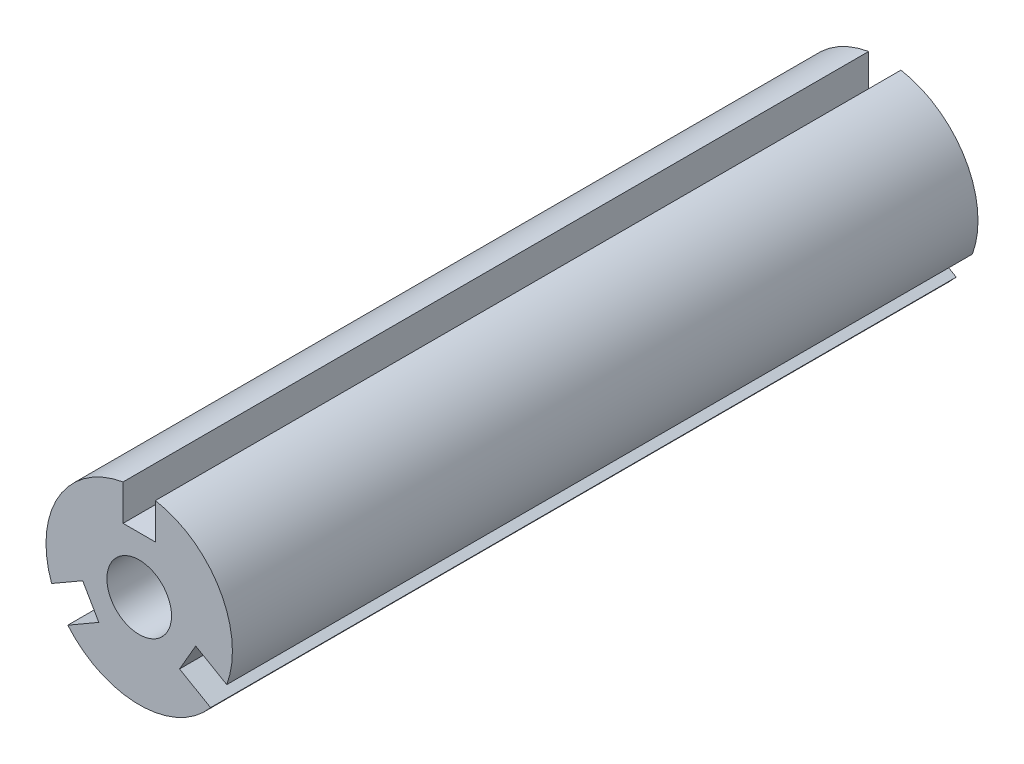
ISO-10303-21;
HEADER;
FILE_DESCRIPTION(('STEP AP214'),'2;1');
FILE_NAME('part.step','',(''),(''),'','','');
FILE_SCHEMA(('AUTOMOTIVE_DESIGN { 1 0 10303 214 1 1 1 1 }'));
ENDSEC;
DATA;
#1=APPLICATION_CONTEXT('core data for automotive mechanical design processes');
#2=APPLICATION_PROTOCOL_DEFINITION('international standard','automotive_design',2000,#1);
#3=PRODUCT_CONTEXT('',#1,'mechanical');
#4=PRODUCT('Part','Part','',(#3));
#5=PRODUCT_RELATED_PRODUCT_CATEGORY('part','',(#4));
#6=PRODUCT_DEFINITION_FORMATION('','',#4);
#7=PRODUCT_DEFINITION_CONTEXT('part definition',#1,'design');
#8=PRODUCT_DEFINITION('design','',#6,#7);
#9=PRODUCT_DEFINITION_SHAPE('','',#8);
#10=(LENGTH_UNIT() NAMED_UNIT(*) SI_UNIT(.MILLI.,.METRE.));
#11=(NAMED_UNIT(*) PLANE_ANGLE_UNIT() SI_UNIT($,.RADIAN.));
#12=(NAMED_UNIT(*) SI_UNIT($,.STERADIAN.) SOLID_ANGLE_UNIT());
#13=UNCERTAINTY_MEASURE_WITH_UNIT(LENGTH_MEASURE(1.E-05),#10,'distance_accuracy_value','');
#14=(GEOMETRIC_REPRESENTATION_CONTEXT(3) GLOBAL_UNCERTAINTY_ASSIGNED_CONTEXT((#13)) GLOBAL_UNIT_ASSIGNED_CONTEXT((#10,
#11,#12)) REPRESENTATION_CONTEXT('',''));
#15=CARTESIAN_POINT('',(0.,0.,0.));
#16=DIRECTION('',(0.,0.,1.));
#17=DIRECTION('',(1.,0.,0.));
#18=AXIS2_PLACEMENT_3D('',#15,#16,#17);
#19=CARTESIAN_POINT('',(0.,0.,60.));
#20=DIRECTION('',(0.,0.,-1.));
#21=DIRECTION('',(-1.,0.,0.));
#22=AXIS2_PLACEMENT_3D('',#19,#20,#21);
#23=CYLINDRICAL_SURFACE('',#22,7.5);
#24=CARTESIAN_POINT('',(0.,0.,0.));
#25=DIRECTION('',(0.,0.,1.));
#26=DIRECTION('',(1.,0.,0.));
#27=AXIS2_PLACEMENT_3D('',#24,#25,#26);
#28=CIRCLE('',#27,7.5);
#29=CARTESIAN_POINT('',(-1.30000000000044,7.38647412504768,0.));
#30=VERTEX_POINT('',#29);
#31=CARTESIAN_POINT('',(-7.04687423668763,-2.56740403760453,0.));
#32=VERTEX_POINT('',#31);
#33=EDGE_CURVE('E164',#30,#32,#28,.T.);
#34=ORIENTED_EDGE('',*,*,#33,.T.);
#35=DIRECTION('',(0.,0.,-1.));
#36=VECTOR('',#35,1.);
#37=CARTESIAN_POINT('',(-7.04687423668763,-2.56740403760453,60.));
#38=LINE('',#37,#36);
#39=CARTESIAN_POINT('',(-7.04687423668763,-2.56740403760453,60.));
#40=VERTEX_POINT('',#39);
#41=EDGE_CURVE('E11',#40,#32,#38,.T.);
#42=ORIENTED_EDGE('',*,*,#41,.F.);
#43=CARTESIAN_POINT('',(0.,0.,60.));
#44=DIRECTION('',(0.,0.,1.));
#45=DIRECTION('',(1.,0.,0.));
#46=AXIS2_PLACEMENT_3D('',#43,#44,#45);
#47=CIRCLE('',#46,7.5);
#48=CARTESIAN_POINT('',(-1.30000000000044,7.38647412504768,60.));
#49=VERTEX_POINT('',#48);
#50=EDGE_CURVE('E187',#49,#40,#47,.T.);
#51=ORIENTED_EDGE('',*,*,#50,.F.);
#52=DIRECTION('',(0.,0.,-1.));
#53=VECTOR('',#52,1.);
#54=CARTESIAN_POINT('',(-1.30000000000044,7.38647412504768,60.));
#55=LINE('',#54,#53);
#56=EDGE_CURVE('E160',#49,#30,#55,.T.);
#57=ORIENTED_EDGE('',*,*,#56,.T.);
#58=EDGE_LOOP('',(#34,#42,#51,#57));
#59=FACE_BOUND('',#58,.T.);
#60=ADVANCED_FACE('F38',(#59),#23,.T.);
#61=CARTESIAN_POINT('',(-7.04687423668763,-2.56740403760453,60.));
#62=DIRECTION('',(-0.499999999999999,0.866025403784439,0.));
#63=DIRECTION('',(-0.866025403784439,-0.499999999999999,0.));
#64=AXIS2_PLACEMENT_3D('',#61,#62,#63);
#65=PLANE('',#64);
#66=DIRECTION('',(0.866025403784439,0.499999999999999,0.));
#67=VECTOR('',#66,1.);
#68=CARTESIAN_POINT('',(-7.04687423668763,-2.56740403760453,0.));
#69=LINE('',#68,#67);
#70=CARTESIAN_POINT('',(-4.54711431702975,-1.12416697508062,0.));
#71=VERTEX_POINT('',#70);
#72=EDGE_CURVE('E167',#32,#71,#69,.T.);
#73=ORIENTED_EDGE('',*,*,#72,.T.);
#74=DIRECTION('',(0.,0.,-1.));
#75=VECTOR('',#74,1.);
#76=CARTESIAN_POINT('',(-4.54711431702975,-1.12416697508062,60.));
#77=LINE('',#76,#75);
#78=CARTESIAN_POINT('',(-4.54711431702975,-1.12416697508062,60.));
#79=VERTEX_POINT('',#78);
#80=EDGE_CURVE('E52',#79,#71,#77,.T.);
#81=ORIENTED_EDGE('',*,*,#80,.F.);
#82=DIRECTION('',(0.866025403784439,0.499999999999999,0.));
#83=VECTOR('',#82,1.);
#84=CARTESIAN_POINT('',(-7.04687423668763,-2.56740403760453,60.));
#85=LINE('',#84,#83);
#86=EDGE_CURVE('E115',#40,#79,#85,.T.);
#87=ORIENTED_EDGE('',*,*,#86,.F.);
#88=ORIENTED_EDGE('',*,*,#41,.T.);
#89=EDGE_LOOP('',(#73,#81,#87,#88));
#90=FACE_BOUND('',#89,.T.);
#91=ADVANCED_FACE('F267',(#90),#65,.F.);
#92=CARTESIAN_POINT('',(-3.24711431702975,-3.37583302492016,60.));
#93=DIRECTION('',(0.866025403784438,0.5,0.));
#94=DIRECTION('',(-0.500000000000001,0.866025403784438,0.));
#95=AXIS2_PLACEMENT_3D('',#92,#93,#94);
#96=PLANE('',#95);
#97=DIRECTION('',(0.500000000000001,-0.866025403784438,0.));
#98=VECTOR('',#97,1.);
#99=CARTESIAN_POINT('',(-3.24711431702975,-3.37583302492016,0.));
#100=LINE('',#99,#98);
#101=CARTESIAN_POINT('',(-3.24711431702975,-3.37583302492016,0.));
#102=VERTEX_POINT('',#101);
#103=EDGE_CURVE('E170',#71,#102,#100,.T.);
#104=ORIENTED_EDGE('',*,*,#103,.T.);
#105=DIRECTION('',(0.,0.,-1.));
#106=VECTOR('',#105,1.);
#107=CARTESIAN_POINT('',(-3.24711431702975,-3.37583302492016,60.));
#108=LINE('',#107,#106);
#109=CARTESIAN_POINT('',(-3.24711431702975,-3.37583302492016,60.));
#110=VERTEX_POINT('',#109);
#111=EDGE_CURVE('E206',#110,#102,#108,.T.);
#112=ORIENTED_EDGE('',*,*,#111,.F.);
#113=DIRECTION('',(0.500000000000001,-0.866025403784438,0.));
#114=VECTOR('',#113,1.);
#115=CARTESIAN_POINT('',(-3.24711431702975,-3.37583302492016,60.));
#116=LINE('',#115,#114);
#117=EDGE_CURVE('E215',#79,#110,#116,.T.);
#118=ORIENTED_EDGE('',*,*,#117,.F.);
#119=ORIENTED_EDGE('',*,*,#80,.T.);
#120=EDGE_LOOP('',(#104,#112,#118,#119));
#121=FACE_BOUND('',#120,.T.);
#122=ADVANCED_FACE('F213',(#121),#96,.F.);
#123=CARTESIAN_POINT('',(-5.7468742366875,-4.81907008744399,60.));
#124=DIRECTION('',(0.499999999999999,-0.866025403784439,0.));
#125=DIRECTION('',(0.866025403784439,0.499999999999999,0.));
#126=AXIS2_PLACEMENT_3D('',#123,#124,#125);
#127=PLANE('',#126);
#128=DIRECTION('',(-0.866025403784439,-0.499999999999999,0.));
#129=VECTOR('',#128,1.);
#130=CARTESIAN_POINT('',(-5.7468742366875,-4.81907008744399,0.));
#131=LINE('',#130,#129);
#132=CARTESIAN_POINT('',(-5.7468742366875,-4.81907008744399,0.));
#133=VERTEX_POINT('',#132);
#134=EDGE_CURVE('E172',#102,#133,#131,.T.);
#135=ORIENTED_EDGE('',*,*,#134,.T.);
#136=DIRECTION('',(0.,0.,-1.));
#137=VECTOR('',#136,1.);
#138=CARTESIAN_POINT('',(-5.7468742366875,-4.81907008744399,60.));
#139=LINE('',#138,#137);
#140=CARTESIAN_POINT('',(-5.7468742366875,-4.81907008744399,60.));
#141=VERTEX_POINT('',#140);
#142=EDGE_CURVE('E203',#141,#133,#139,.T.);
#143=ORIENTED_EDGE('',*,*,#142,.F.);
#144=DIRECTION('',(-0.866025403784439,-0.499999999999999,0.));
#145=VECTOR('',#144,1.);
#146=CARTESIAN_POINT('',(-5.7468742366875,-4.81907008744399,60.));
#147=LINE('',#146,#145);
#148=EDGE_CURVE('E233',#110,#141,#147,.T.);
#149=ORIENTED_EDGE('',*,*,#148,.F.);
#150=ORIENTED_EDGE('',*,*,#111,.T.);
#151=EDGE_LOOP('',(#135,#143,#149,#150));
#152=FACE_BOUND('',#151,.T.);
#153=ADVANCED_FACE('F224',(#152),#127,.F.);
#154=CARTESIAN_POINT('',(0.,0.,60.));
#155=DIRECTION('',(0.,0.,-1.));
#156=DIRECTION('',(-1.,0.,0.));
#157=AXIS2_PLACEMENT_3D('',#154,#155,#156);
#158=CYLINDRICAL_SURFACE('',#157,7.5);
#159=CARTESIAN_POINT('',(0.,-7.5,32.4));
#160=CARTESIAN_POINT('',(0.13124370947397,-7.4999996781544,32.3999996345241));
#161=CARTESIAN_POINT('',(0.262491955588592,-7.49652276234533,32.3891991070811));
#162=CARTESIAN_POINT('',(0.521140351856224,-7.4829939325834,32.3464022707061));
#163=CARTESIAN_POINT('',(0.648539795060562,-7.47294081830337,32.3144020922731));
#164=CARTESIAN_POINT('',(0.895723838687348,-7.44735575453114,32.2304026181823));
#165=CARTESIAN_POINT('',(1.01552021007689,-7.43183253067787,32.1784351614441));
#166=CARTESIAN_POINT('',(1.24469814427674,-7.39690352464308,32.0561147548691));
#167=CARTESIAN_POINT('',(1.35407791053742,-7.37749707450578,31.9857586413516));
#168=CARTESIAN_POINT('',(1.56284213669247,-7.33615601900737,31.826273829744));
#169=CARTESIAN_POINT('',(1.6618441383696,-7.31416436599377,31.7366593515699));
#170=CARTESIAN_POINT('',(1.84370135539842,-7.27045598554605,31.5422354001789));
#171=CARTESIAN_POINT('',(1.92655337690696,-7.24873931328492,31.4374229285177));
#172=CARTESIAN_POINT('',(2.07587092610747,-7.20742216198544,31.2122207182344));
#173=CARTESIAN_POINT('',(2.14185184664916,-7.18789178453125,31.0914955780942));
#174=CARTESIAN_POINT('',(2.25241375701885,-7.15401986697968,30.8399364843448));
#175=CARTESIAN_POINT('',(2.2970006965999,-7.13967688452024,30.7091053530175));
#176=CARTESIAN_POINT('',(2.36209701466982,-7.11840184140896,30.4453760890907));
#177=CARTESIAN_POINT('',(2.38331845269578,-7.11125122399116,30.3126718473719));
#178=CARTESIAN_POINT('',(2.40330649588276,-7.104522465675,30.0454086012233));
#179=CARTESIAN_POINT('',(2.4020794064058,-7.10494219840959,29.910850128222));
#180=CARTESIAN_POINT('',(2.37776071104571,-7.11311428650112,29.6496516226676));
#181=CARTESIAN_POINT('',(2.35558263199087,-7.1205602614563,29.5229153198329));
#182=CARTESIAN_POINT('',(2.29147588461208,-7.14144686169243,29.2750667333669));
#183=CARTESIAN_POINT('',(2.24954502403991,-7.15488815235037,29.1539550756222));
#184=CARTESIAN_POINT('',(2.14649467738218,-7.1864798124546,28.9186532117614));
#185=CARTESIAN_POINT('',(2.08509409655584,-7.20469844204043,28.8045956700728));
#186=CARTESIAN_POINT('',(1.94504241501101,-7.24376167291752,28.5881069354599));
#187=CARTESIAN_POINT('',(1.86638665240732,-7.2646069832181,28.4856788958847));
#188=CARTESIAN_POINT('',(1.6896082731058,-7.30779558212807,28.2902029907006));
#189=CARTESIAN_POINT('',(1.59073404374104,-7.3301628121227,28.1978388345918));
#190=CARTESIAN_POINT('',(1.37862214832573,-7.37299752172316,28.0308319826495));
#191=CARTESIAN_POINT('',(1.26538331347904,-7.3934648465056,27.9561907302857));
#192=CARTESIAN_POINT('',(1.02639237106856,-7.43042684616876,27.8262548350797));
#193=CARTESIAN_POINT('',(0.900541919160954,-7.44688620821913,27.7711303487453));
#194=CARTESIAN_POINT('',(0.640703775541696,-7.47372241650294,27.6830406050059));
#195=CARTESIAN_POINT('',(0.506718694697322,-7.48410120306955,27.6500682782749));
#196=CARTESIAN_POINT('',(0.240212684383977,-7.49729136358702,27.6083999000022));
#197=CARTESIAN_POINT('',(0.10785042902561,-7.50039090267231,27.5987788895834));
#198=CARTESIAN_POINT('',(-0.156615404382159,-7.49952982977666,27.601468827332));
#199=CARTESIAN_POINT('',(-0.28871901913116,-7.49557030506309,27.6137763979648));
#200=CARTESIAN_POINT('',(-0.545302527305719,-7.48122570476245,27.6592351696217));
#201=CARTESIAN_POINT('',(-0.669891543717035,-7.47101229973898,27.6918298651289));
#202=CARTESIAN_POINT('',(-0.911792481900874,-7.44536378993023,27.7762526990944));
#203=CARTESIAN_POINT('',(-1.02910349069119,-7.4299280315932,27.8280832449033));
#204=CARTESIAN_POINT('',(-1.25639538580567,-7.39493296529857,27.9509565257672));
#205=CARTESIAN_POINT('',(-1.36611843075145,-7.37527989405135,28.0224487679135));
#206=CARTESIAN_POINT('',(-1.57231725450993,-7.3340911236072,28.1820808094784));
#207=CARTESIAN_POINT('',(-1.66878926333098,-7.31255489148117,28.2702253296875));
#208=CARTESIAN_POINT('',(-1.84992482232953,-7.26889450924855,28.4650112394164));
#209=CARTESIAN_POINT('',(-1.9339286921343,-7.24678326250102,28.5722704015327));
#210=CARTESIAN_POINT('',(-2.08281212988854,-7.20540664665217,28.7998420116873));
#211=CARTESIAN_POINT('',(-2.14769185538462,-7.18614125410707,28.9201543521811));
#212=CARTESIAN_POINT('',(-2.25611370451847,-7.15284394329862,29.1702653679841));
#213=CARTESIAN_POINT('',(-2.29972599461169,-7.13879485230076,29.3000312024845));
#214=CARTESIAN_POINT('',(-2.36431002369302,-7.11766922548992,29.5656108147155));
#215=CARTESIAN_POINT('',(-2.3852909250985,-7.110589868051,29.701422121704));
#216=CARTESIAN_POINT('',(-2.40333802967349,-7.10450891848152,29.968313953746));
#217=CARTESIAN_POINT('',(-2.40149082669009,-7.10514028637073,30.0993135169935));
#218=CARTESIAN_POINT('',(-2.37657532724055,-7.11351238640617,30.3590355081521));
#219=CARTESIAN_POINT('',(-2.35350811291681,-7.12125275601947,30.4877580518416));
#220=CARTESIAN_POINT('',(-2.28754998624692,-7.14270814716624,30.7372251380653));
#221=CARTESIAN_POINT('',(-2.24498441914059,-7.15632490855144,30.8580647983393));
#222=CARTESIAN_POINT('',(-2.14149641226573,-7.18796963391543,31.0909826406012));
#223=CARTESIAN_POINT('',(-2.08057011171938,-7.20599852549879,31.2030589736441));
#224=CARTESIAN_POINT('',(-1.93918900061148,-7.24535241552564,31.4202144447216));
#225=CARTESIAN_POINT('',(-1.85803962647367,-7.2667817857902,31.5248223941011));
#226=CARTESIAN_POINT('',(-1.67972099689326,-7.3100577127103,31.7192876187314));
#227=CARTESIAN_POINT('',(-1.58254737250234,-7.33190438170043,31.809140857798));
#228=CARTESIAN_POINT('',(-1.37086831544753,-7.37446662300175,31.9746874288858));
#229=CARTESIAN_POINT('',(-1.25587702764117,-7.39511627820578,32.0497784278265));
#230=CARTESIAN_POINT('',(-1.01424529489041,-7.4321068154679,32.1794702821458));
#231=CARTESIAN_POINT('',(-0.887608894812236,-7.4484491860694,32.2340782189812));
#232=CARTESIAN_POINT('',(-0.635495147467268,-7.47402511596098,32.3178716697457));
#233=CARTESIAN_POINT('',(-0.510565149730997,-7.48367851952176,32.3485776758747));
#234=CARTESIAN_POINT('',(-0.257091001614181,-7.49666540312091,32.389639714356));
#235=CARTESIAN_POINT('',(-0.128547676892093,-7.50000031523419,32.4000003579682));
#236=CARTESIAN_POINT('',(0.,-7.5,32.4));
#237=B_SPLINE_CURVE_WITH_KNOTS('',3,(#159,#160,#161,#162,#163,#164,#165,#166,#167,#168,#169,
#170,#171,#172,#173,#174,#175,#176,#177,#178,#179,#180,#181,#182,#183,#184,#185,#186,#187,#188,
#189,#190,#191,#192,#193,#194,#195,#196,#197,#198,#199,#200,#201,#202,#203,#204,#205,#206,#207,
#208,#209,#210,#211,#212,#213,#214,#215,#216,#217,#218,#219,#220,#221,#222,#223,#224,#225,#226,
#227,#228,#229,#230,#231,#232,#233,#234,#235,#236),.UNSPECIFIED.,.T.,.F.,(4,2,2,2,2,2,2,2,2,2,2,
2,2,2,2,2,2,2,2,2,2,2,2,2,2,2,2,2,2,2,2,2,2,2,2,2,2,2,4),(0.,0.393258434799731,
0.786588669522547,1.17929430316757,1.57206754447054,1.9762457722735,2.38050385002639,
2.7953224323994,3.21002558507932,3.6117073499926,4.01327629191335,4.39810634027168,
4.78297910878167,5.17368293902145,5.56449245719513,5.97400927212934,6.38355942936832,
6.79659707001292,7.20950283699523,7.60576515887017,8.00196645199048,8.38775124581683,
8.773584336575,9.16910032582622,9.56472860947227,9.97684489579589,10.3889577869691,
10.7997016601266,11.2102791793319,11.6013920245927,11.9924849256448,12.3772773432197,
12.7621507290106,13.1627063501388,13.5633713622838,13.9779942829689,14.3924737267459,
14.7777411045802,15.1629211517942),.UNSPECIFIED.);
#238=CARTESIAN_POINT('',(0.,-7.5,32.4));
#239=VERTEX_POINT('',#238);
#240=EDGE_CURVE('E285',#239,#239,#237,.T.);
#241=ORIENTED_EDGE('',*,*,#240,.T.);
#242=EDGE_LOOP('',(#241));
#243=FACE_BOUND('',#242,.T.);
#244=CARTESIAN_POINT('',(0.,0.,0.));
#245=DIRECTION('',(0.,0.,1.));
#246=DIRECTION('',(1.,0.,0.));
#247=AXIS2_PLACEMENT_3D('',#244,#245,#246);
#248=CIRCLE('',#247,7.5);
#249=CARTESIAN_POINT('',(5.74687423668808,-4.8190700874433,0.));
#250=VERTEX_POINT('',#249);
#251=EDGE_CURVE('E174',#133,#250,#248,.T.);
#252=ORIENTED_EDGE('',*,*,#251,.T.);
#253=DIRECTION('',(0.,0.,-1.));
#254=VECTOR('',#253,1.);
#255=CARTESIAN_POINT('',(5.74687423668808,-4.8190700874433,60.));
#256=LINE('',#255,#254);
#257=CARTESIAN_POINT('',(5.74687423668808,-4.8190700874433,60.));
#258=VERTEX_POINT('',#257);
#259=EDGE_CURVE('E200',#258,#250,#256,.T.);
#260=ORIENTED_EDGE('',*,*,#259,.F.);
#261=CARTESIAN_POINT('',(0.,0.,60.));
#262=DIRECTION('',(0.,0.,1.));
#263=DIRECTION('',(1.,0.,0.));
#264=AXIS2_PLACEMENT_3D('',#261,#262,#263);
#265=CIRCLE('',#264,7.5);
#266=EDGE_CURVE('E230',#141,#258,#265,.T.);
#267=ORIENTED_EDGE('',*,*,#266,.F.);
#268=ORIENTED_EDGE('',*,*,#142,.T.);
#269=EDGE_LOOP('',(#252,#260,#267,#268));
#270=FACE_BOUND('',#269,.T.);
#271=ADVANCED_FACE('F228',(#243,#270),#158,.T.);
#272=CARTESIAN_POINT('',(5.74687423668808,-4.8190700874433,60.));
#273=DIRECTION('',(-0.500000000000002,-0.866025403784438,0.));
#274=DIRECTION('',(0.866025403784438,-0.500000000000002,0.));
#275=AXIS2_PLACEMENT_3D('',#272,#273,#274);
#276=PLANE('',#275);
#277=DIRECTION('',(-0.866025403784438,0.500000000000002,0.));
#278=VECTOR('',#277,1.);
#279=CARTESIAN_POINT('',(5.74687423668808,-4.8190700874433,0.));
#280=LINE('',#279,#278);
#281=CARTESIAN_POINT('',(3.2471143170302,-3.37583302491938,0.));
#282=VERTEX_POINT('',#281);
#283=EDGE_CURVE('E176',#250,#282,#280,.T.);
#284=ORIENTED_EDGE('',*,*,#283,.T.);
#285=DIRECTION('',(0.,0.,-1.));
#286=VECTOR('',#285,1.);
#287=CARTESIAN_POINT('',(3.2471143170302,-3.37583302491938,60.));
#288=LINE('',#287,#286);
#289=CARTESIAN_POINT('',(3.2471143170302,-3.37583302491938,60.));
#290=VERTEX_POINT('',#289);
#291=EDGE_CURVE('E197',#290,#282,#288,.T.);
#292=ORIENTED_EDGE('',*,*,#291,.F.);
#293=DIRECTION('',(-0.866025403784438,0.500000000000002,0.));
#294=VECTOR('',#293,1.);
#295=CARTESIAN_POINT('',(5.74687423668808,-4.8190700874433,60.));
#296=LINE('',#295,#294);
#297=EDGE_CURVE('E232',#258,#290,#296,.T.);
#298=ORIENTED_EDGE('',*,*,#297,.F.);
#299=ORIENTED_EDGE('',*,*,#259,.T.);
#300=EDGE_LOOP('',(#284,#292,#298,#299));
#301=FACE_BOUND('',#300,.T.);
#302=ADVANCED_FACE('F281',(#301),#276,.F.);
#303=CARTESIAN_POINT('',(4.5471143170302,-1.12416697507984,60.));
#304=DIRECTION('',(-0.866025403784439,0.5,0.));
#305=DIRECTION('',(-0.5,-0.866025403784439,0.));
#306=AXIS2_PLACEMENT_3D('',#303,#304,#305);
#307=PLANE('',#306);
#308=DIRECTION('',(0.5,0.866025403784439,0.));
#309=VECTOR('',#308,1.);
#310=CARTESIAN_POINT('',(4.5471143170302,-1.12416697507984,0.));
#311=LINE('',#310,#309);
#312=CARTESIAN_POINT('',(4.5471143170302,-1.12416697507984,0.));
#313=VERTEX_POINT('',#312);
#314=EDGE_CURVE('E178',#282,#313,#311,.T.);
#315=ORIENTED_EDGE('',*,*,#314,.T.);
#316=DIRECTION('',(0.,0.,-1.));
#317=VECTOR('',#316,1.);
#318=CARTESIAN_POINT('',(4.5471143170302,-1.12416697507984,60.));
#319=LINE('',#318,#317);
#320=CARTESIAN_POINT('',(4.5471143170302,-1.12416697507984,60.));
#321=VERTEX_POINT('',#320);
#322=EDGE_CURVE('E194',#321,#313,#319,.T.);
#323=ORIENTED_EDGE('',*,*,#322,.F.);
#324=DIRECTION('',(0.5,0.866025403784439,0.));
#325=VECTOR('',#324,1.);
#326=CARTESIAN_POINT('',(4.5471143170302,-1.12416697507984,60.));
#327=LINE('',#326,#325);
#328=EDGE_CURVE('E235',#290,#321,#327,.T.);
#329=ORIENTED_EDGE('',*,*,#328,.F.);
#330=ORIENTED_EDGE('',*,*,#291,.T.);
#331=EDGE_LOOP('',(#315,#323,#329,#330));
#332=FACE_BOUND('',#331,.T.);
#333=ADVANCED_FACE('F366',(#332),#307,.F.);
#334=CARTESIAN_POINT('',(7.04687423668794,-2.56740403760368,60.));
#335=DIRECTION('',(0.500000000000001,0.866025403784438,0.));
#336=DIRECTION('',(-0.866025403784438,0.500000000000001,0.));
#337=AXIS2_PLACEMENT_3D('',#334,#335,#336);
#338=PLANE('',#337);
#339=DIRECTION('',(0.866025403784438,-0.500000000000001,0.));
#340=VECTOR('',#339,1.);
#341=CARTESIAN_POINT('',(7.04687423668794,-2.56740403760368,0.));
#342=LINE('',#341,#340);
#343=CARTESIAN_POINT('',(7.04687423668794,-2.56740403760368,0.));
#344=VERTEX_POINT('',#343);
#345=EDGE_CURVE('E180',#313,#344,#342,.T.);
#346=ORIENTED_EDGE('',*,*,#345,.T.);
#347=DIRECTION('',(0.,0.,-1.));
#348=VECTOR('',#347,1.);
#349=CARTESIAN_POINT('',(7.04687423668794,-2.56740403760368,60.));
#350=LINE('',#349,#348);
#351=CARTESIAN_POINT('',(7.04687423668794,-2.56740403760368,60.));
#352=VERTEX_POINT('',#351);
#353=EDGE_CURVE('E191',#352,#344,#350,.T.);
#354=ORIENTED_EDGE('',*,*,#353,.F.);
#355=DIRECTION('',(0.866025403784438,-0.500000000000001,0.));
#356=VECTOR('',#355,1.);
#357=CARTESIAN_POINT('',(7.04687423668794,-2.56740403760368,60.));
#358=LINE('',#357,#356);
#359=EDGE_CURVE('E241',#321,#352,#358,.T.);
#360=ORIENTED_EDGE('',*,*,#359,.F.);
#361=ORIENTED_EDGE('',*,*,#322,.T.);
#362=EDGE_LOOP('',(#346,#354,#360,#361));
#363=FACE_BOUND('',#362,.T.);
#364=ADVANCED_FACE('F247',(#363),#338,.F.);
#365=CARTESIAN_POINT('',(0.,0.,60.));
#366=DIRECTION('',(0.,0.,-1.));
#367=DIRECTION('',(-1.,0.,0.));
#368=AXIS2_PLACEMENT_3D('',#365,#366,#367);
#369=CYLINDRICAL_SURFACE('',#368,7.5);
#370=CARTESIAN_POINT('',(0.,0.,0.));
#371=DIRECTION('',(0.,0.,1.));
#372=DIRECTION('',(1.,0.,0.));
#373=AXIS2_PLACEMENT_3D('',#370,#371,#372);
#374=CIRCLE('',#373,7.5);
#375=CARTESIAN_POINT('',(1.29999999999956,7.38647412504783,0.));
#376=VERTEX_POINT('',#375);
#377=EDGE_CURVE('E182',#344,#376,#374,.T.);
#378=ORIENTED_EDGE('',*,*,#377,.T.);
#379=DIRECTION('',(0.,0.,-1.));
#380=VECTOR('',#379,1.);
#381=CARTESIAN_POINT('',(1.29999999999956,7.38647412504783,60.));
#382=LINE('',#381,#380);
#383=CARTESIAN_POINT('',(1.29999999999956,7.38647412504783,60.));
#384=VERTEX_POINT('',#383);
#385=EDGE_CURVE('E155',#384,#376,#382,.T.);
#386=ORIENTED_EDGE('',*,*,#385,.F.);
#387=CARTESIAN_POINT('',(0.,0.,60.));
#388=DIRECTION('',(0.,0.,1.));
#389=DIRECTION('',(1.,0.,0.));
#390=AXIS2_PLACEMENT_3D('',#387,#388,#389);
#391=CIRCLE('',#390,7.5);
#392=EDGE_CURVE('E146',#352,#384,#391,.T.);
#393=ORIENTED_EDGE('',*,*,#392,.F.);
#394=ORIENTED_EDGE('',*,*,#353,.T.);
#395=EDGE_LOOP('',(#378,#386,#393,#394));
#396=FACE_BOUND('',#395,.T.);
#397=ADVANCED_FACE('F251',(#396),#369,.T.);
#398=CARTESIAN_POINT('',(1.29999999999956,7.38647412504783,60.));
#399=DIRECTION('',(1.,0.,0.));
#400=DIRECTION('',(0.,1.,0.));
#401=AXIS2_PLACEMENT_3D('',#398,#399,#400);
#402=PLANE('',#401);
#403=DIRECTION('',(0.,-1.,0.));
#404=VECTOR('',#403,1.);
#405=CARTESIAN_POINT('',(1.29999999999956,7.38647412504783,0.));
#406=LINE('',#405,#404);
#407=CARTESIAN_POINT('',(1.29999999999955,4.5,0.));
#408=VERTEX_POINT('',#407);
#409=EDGE_CURVE('E154',#376,#408,#406,.T.);
#410=ORIENTED_EDGE('',*,*,#409,.T.);
#411=DIRECTION('',(0.,0.,-1.));
#412=VECTOR('',#411,1.);
#413=CARTESIAN_POINT('',(1.29999999999955,4.5,60.));
#414=LINE('',#413,#412);
#415=CARTESIAN_POINT('',(1.29999999999955,4.5,60.));
#416=VERTEX_POINT('',#415);
#417=EDGE_CURVE('E151',#416,#408,#414,.T.);
#418=ORIENTED_EDGE('',*,*,#417,.F.);
#419=DIRECTION('',(0.,-1.,0.));
#420=VECTOR('',#419,1.);
#421=CARTESIAN_POINT('',(1.29999999999956,7.38647412504783,60.));
#422=LINE('',#421,#420);
#423=EDGE_CURVE('E140',#384,#416,#422,.T.);
#424=ORIENTED_EDGE('',*,*,#423,.F.);
#425=ORIENTED_EDGE('',*,*,#385,.T.);
#426=EDGE_LOOP('',(#410,#418,#424,#425));
#427=FACE_BOUND('',#426,.T.);
#428=ADVANCED_FACE('F152',(#427),#402,.F.);
#429=CARTESIAN_POINT('',(-1.30000000000045,4.5,60.));
#430=DIRECTION('',(0.,-1.,0.));
#431=DIRECTION('',(0.,0.,-1.));
#432=AXIS2_PLACEMENT_3D('',#429,#430,#431);
#433=PLANE('',#432);
#434=DIRECTION('',(-1.,0.,0.));
#435=VECTOR('',#434,1.);
#436=CARTESIAN_POINT('',(-1.30000000000045,4.5,0.));
#437=LINE('',#436,#435);
#438=CARTESIAN_POINT('',(-1.30000000000045,4.5,0.));
#439=VERTEX_POINT('',#438);
#440=EDGE_CURVE('E101',#408,#439,#437,.T.);
#441=ORIENTED_EDGE('',*,*,#440,.T.);
#442=DIRECTION('',(0.,0.,-1.));
#443=VECTOR('',#442,1.);
#444=CARTESIAN_POINT('',(-1.30000000000045,4.5,60.));
#445=LINE('',#444,#443);
#446=CARTESIAN_POINT('',(-1.30000000000045,4.5,60.));
#447=VERTEX_POINT('',#446);
#448=EDGE_CURVE('E156',#447,#439,#445,.T.);
#449=ORIENTED_EDGE('',*,*,#448,.F.);
#450=DIRECTION('',(-1.,0.,0.));
#451=VECTOR('',#450,1.);
#452=CARTESIAN_POINT('',(-1.30000000000045,4.5,60.));
#453=LINE('',#452,#451);
#454=EDGE_CURVE('E144',#416,#447,#453,.T.);
#455=ORIENTED_EDGE('',*,*,#454,.F.);
#456=ORIENTED_EDGE('',*,*,#417,.T.);
#457=EDGE_LOOP('',(#441,#449,#455,#456));
#458=FACE_BOUND('',#457,.T.);
#459=ADVANCED_FACE('F158',(#458),#433,.F.);
#460=CARTESIAN_POINT('',(-1.30000000000044,7.38647412504768,60.));
#461=DIRECTION('',(-1.,0.,0.));
#462=DIRECTION('',(0.,-1.,0.));
#463=AXIS2_PLACEMENT_3D('',#460,#461,#462);
#464=PLANE('',#463);
#465=DIRECTION('',(0.,1.,0.));
#466=VECTOR('',#465,1.);
#467=CARTESIAN_POINT('',(-1.30000000000044,7.38647412504768,0.));
#468=LINE('',#467,#466);
#469=EDGE_CURVE('E107',#439,#30,#468,.T.);
#470=ORIENTED_EDGE('',*,*,#469,.T.);
#471=ORIENTED_EDGE('',*,*,#56,.F.);
#472=DIRECTION('',(0.,1.,0.));
#473=VECTOR('',#472,1.);
#474=CARTESIAN_POINT('',(-1.30000000000044,7.38647412504768,60.));
#475=LINE('',#474,#473);
#476=EDGE_CURVE('E60',#447,#49,#475,.T.);
#477=ORIENTED_EDGE('',*,*,#476,.F.);
#478=ORIENTED_EDGE('',*,*,#448,.T.);
#479=EDGE_LOOP('',(#470,#471,#477,#478));
#480=FACE_BOUND('',#479,.T.);
#481=ADVANCED_FACE('F255',(#480),#464,.F.);
#482=CARTESIAN_POINT('',(0.,0.,60.));
#483=DIRECTION('',(0.,0.,1.));
#484=DIRECTION('',(1.,0.,0.));
#485=AXIS2_PLACEMENT_3D('',#482,#483,#484);
#486=PLANE('',#485);
#487=CARTESIAN_POINT('',(0.,0.,60.));
#488=DIRECTION('',(0.,0.,1.));
#489=DIRECTION('',(1.,0.,0.));
#490=AXIS2_PLACEMENT_3D('',#487,#488,#489);
#491=CIRCLE('',#490,2.6);
#492=CARTESIAN_POINT('',(2.6,0.,60.));
#493=VERTEX_POINT('',#492);
#494=EDGE_CURVE('E291',#493,#493,#491,.T.);
#495=ORIENTED_EDGE('',*,*,#494,.F.);
#496=EDGE_LOOP('',(#495));
#497=FACE_BOUND('',#496,.T.);
#498=ORIENTED_EDGE('',*,*,#50,.T.);
#499=ORIENTED_EDGE('',*,*,#86,.T.);
#500=ORIENTED_EDGE('',*,*,#117,.T.);
#501=ORIENTED_EDGE('',*,*,#148,.T.);
#502=ORIENTED_EDGE('',*,*,#266,.T.);
#503=ORIENTED_EDGE('',*,*,#297,.T.);
#504=ORIENTED_EDGE('',*,*,#328,.T.);
#505=ORIENTED_EDGE('',*,*,#359,.T.);
#506=ORIENTED_EDGE('',*,*,#392,.T.);
#507=ORIENTED_EDGE('',*,*,#423,.T.);
#508=ORIENTED_EDGE('',*,*,#454,.T.);
#509=ORIENTED_EDGE('',*,*,#476,.T.);
#510=EDGE_LOOP('',(#498,#499,#500,#501,#502,#503,#504,#505,#506,#507,#508,#509));
#511=FACE_BOUND('',#510,.T.);
#512=ADVANCED_FACE('F142',(#497,#511),#486,.T.);
#513=CARTESIAN_POINT('',(0.,0.,0.));
#514=DIRECTION('',(0.,0.,1.));
#515=DIRECTION('',(1.,0.,0.));
#516=AXIS2_PLACEMENT_3D('',#513,#514,#515);
#517=PLANE('',#516);
#518=CARTESIAN_POINT('',(0.,0.,0.));
#519=DIRECTION('',(0.,0.,1.));
#520=DIRECTION('',(1.,0.,0.));
#521=AXIS2_PLACEMENT_3D('',#518,#519,#520);
#522=CIRCLE('',#521,2.6);
#523=CARTESIAN_POINT('',(2.6,0.,0.));
#524=VERTEX_POINT('',#523);
#525=EDGE_CURVE('E168',#524,#524,#522,.T.);
#526=ORIENTED_EDGE('',*,*,#525,.T.);
#527=EDGE_LOOP('',(#526));
#528=FACE_BOUND('',#527,.T.);
#529=ORIENTED_EDGE('',*,*,#33,.F.);
#530=ORIENTED_EDGE('',*,*,#469,.F.);
#531=ORIENTED_EDGE('',*,*,#440,.F.);
#532=ORIENTED_EDGE('',*,*,#409,.F.);
#533=ORIENTED_EDGE('',*,*,#377,.F.);
#534=ORIENTED_EDGE('',*,*,#345,.F.);
#535=ORIENTED_EDGE('',*,*,#314,.F.);
#536=ORIENTED_EDGE('',*,*,#283,.F.);
#537=ORIENTED_EDGE('',*,*,#251,.F.);
#538=ORIENTED_EDGE('',*,*,#134,.F.);
#539=ORIENTED_EDGE('',*,*,#103,.F.);
#540=ORIENTED_EDGE('',*,*,#72,.F.);
#541=EDGE_LOOP('',(#529,#530,#531,#532,#533,#534,#535,#536,#537,#538,#539,#540));
#542=FACE_BOUND('',#541,.T.);
#543=ADVANCED_FACE('F219',(#528,#542),#517,.F.);
#544=CARTESIAN_POINT('',(0.,0.,0.));
#545=DIRECTION('',(0.,0.,1.));
#546=DIRECTION('',(1.,0.,0.));
#547=AXIS2_PLACEMENT_3D('',#544,#545,#546);
#548=CYLINDRICAL_SURFACE('',#547,2.6);
#549=CARTESIAN_POINT('',(0.,-2.6,32.4));
#550=CARTESIAN_POINT('',(-0.110253293289517,-2.59999193091976,32.3999918557324));
#551=CARTESIAN_POINT('',(-0.220578358244194,-2.59292376288972,32.3923396404243));
#552=CARTESIAN_POINT('',(-0.437496805693455,-2.56526750690049,32.36233565564));
#553=CARTESIAN_POINT('',(-0.544085759557476,-2.54466390989173,32.3399670238822));
#554=CARTESIAN_POINT('',(-0.749796994989789,-2.49178998062186,32.2823557462199));
#555=CARTESIAN_POINT('',(-0.848963357748623,-2.4595964531508,32.2471978373515));
#556=CARTESIAN_POINT('',(-1.03881942943321,-2.38563585985758,32.165995582834));
#557=CARTESIAN_POINT('',(-1.12950597486161,-2.34386524108891,32.1199471967932));
#558=CARTESIAN_POINT('',(-1.33628329340981,-2.2344982810976,31.9984870166154));
#559=CARTESIAN_POINT('',(-1.44789529541142,-2.1632761864279,31.9187185518003));
#560=CARTESIAN_POINT('',(-1.65259463663395,-2.01128516755018,31.7455634384784));
#561=CARTESIAN_POINT('',(-1.74563749150799,-1.93049403964585,31.6521449949053));
#562=CARTESIAN_POINT('',(-1.91578353736409,-1.7619308261401,31.4517247963353));
#563=CARTESIAN_POINT('',(-1.99243414172537,-1.67403529419028,31.3444436060945));
#564=CARTESIAN_POINT('',(-2.09359001406653,-1.54270757935254,31.1752338022373));
#565=CARTESIAN_POINT('',(-2.12499174782237,-1.49904160814595,31.1174834178291));
#566=CARTESIAN_POINT('',(-2.18323658091873,-1.41285960541424,30.9989212370194));
#567=CARTESIAN_POINT('',(-2.21008196509532,-1.37034300656918,30.9381109949732));
#568=CARTESIAN_POINT('',(-2.25843926672024,-1.2890403557874,30.814692854847));
#569=CARTESIAN_POINT('',(-2.28007914215949,-1.25018329889017,30.7521825156896));
#570=CARTESIAN_POINT('',(-2.31869327576771,-1.17701513661225,30.6230600987196));
#571=CARTESIAN_POINT('',(-2.33566673139453,-1.14270481371476,30.5564473177675));
#572=CARTESIAN_POINT('',(-2.36199331033766,-1.08709725093047,30.4295141888591));
#573=CARTESIAN_POINT('',(-2.37213286185081,-1.06459469789769,30.369904087534));
#574=CARTESIAN_POINT('',(-2.38799151571338,-1.02854070687548,30.2475229275543));
#575=CARTESIAN_POINT('',(-2.39372618070245,-1.01495778040557,30.1847638397451));
#576=CARTESIAN_POINT('',(-2.39967397973977,-1.00080884778861,30.067044078534));
#577=CARTESIAN_POINT('',(-2.40058615721642,-0.998596287013189,30.0123252692065));
#578=CARTESIAN_POINT('',(-2.39867279663049,-1.00318129599667,29.903333176367));
#579=CARTESIAN_POINT('',(-2.39584554880426,-1.00998298731168,29.8490601080786));
#580=CARTESIAN_POINT('',(-2.38526167036109,-1.03477209113681,29.7251250122677));
#581=CARTESIAN_POINT('',(-2.37620361223052,-1.05567207158033,29.6561813696714));
#582=CARTESIAN_POINT('',(-2.35300223384909,-1.1064130282759,29.5224706980165));
#583=CARTESIAN_POINT('',(-2.33883559809614,-1.13629489194383,29.4577244508428));
#584=CARTESIAN_POINT('',(-2.30615209349664,-1.20124426916696,29.3322799384286));
#585=CARTESIAN_POINT('',(-2.28764231813448,-1.23630329281943,29.2715752775829));
#586=CARTESIAN_POINT('',(-2.24658906005949,-1.30942760754398,29.15338636981));
#587=CARTESIAN_POINT('',(-2.22404158193293,-1.34749585528981,29.0959053874609));
#588=CARTESIAN_POINT('',(-2.17504555153213,-1.42523427951783,28.9836695578659));
#589=CARTESIAN_POINT('',(-2.14859273942494,-1.46490617045622,28.928917775909));
#590=CARTESIAN_POINT('',(-2.09183122908231,-1.54487863517503,28.8219035804708));
#591=CARTESIAN_POINT('',(-2.06152110778426,-1.58517943613797,28.7696420955555));
#592=CARTESIAN_POINT('',(-1.99271328297662,-1.67108075547432,28.6606792914496));
#593=CARTESIAN_POINT('',(-1.95366273708306,-1.71667083412422,28.6043161507154));
#594=CARTESIAN_POINT('',(-1.87049363339437,-1.80693925540125,28.4946791859523));
#595=CARTESIAN_POINT('',(-1.82637321253713,-1.85161725571232,28.441406508489));
#596=CARTESIAN_POINT('',(-1.686381432995,-1.98303967030676,28.2866886831956));
#597=CARTESIAN_POINT('',(-1.58267932815999,-2.06743236944325,28.1900229077882));
#598=CARTESIAN_POINT('',(-1.3803876313033,-2.20588425623088,28.03355745439));
#599=CARTESIAN_POINT('',(-1.28611136869553,-2.26245510658531,27.9703927946573));
#600=CARTESIAN_POINT('',(-1.08527168664127,-2.36534593839431,27.8562940727371));
#601=CARTESIAN_POINT('',(-0.978722184030948,-2.41167735979778,27.8053463557652));
#602=CARTESIAN_POINT('',(-0.77270783978173,-2.48453014238679,27.7255533775342));
#603=CARTESIAN_POINT('',(-0.674813375292431,-2.51303059624426,27.6944811401753));
#604=CARTESIAN_POINT('',(-0.473332895418666,-2.55863187017592,27.6448579441416));
#605=CARTESIAN_POINT('',(-0.369750579910097,-2.57574000791219,27.6262989477015));
#606=CARTESIAN_POINT('',(-0.159283116503686,-2.59727878899119,27.6029439347014));
#607=CARTESIAN_POINT('',(-0.0523863121799221,-2.6016579172499,27.5982038438745));
#608=CARTESIAN_POINT('',(0.160804104888017,-2.59721172742758,27.6030207308395));
#609=CARTESIAN_POINT('',(0.267097718944866,-2.58838643809333,27.6125776775058));
#610=CARTESIAN_POINT('',(0.46895257402331,-2.55926097628564,27.6441877550228));
#611=CARTESIAN_POINT('',(0.564763759450786,-2.53973801139653,27.6653947284556));
#612=CARTESIAN_POINT('',(0.750808078141309,-2.49109400235788,27.7184087040521));
#613=CARTESIAN_POINT('',(0.841039364215363,-2.46196979976829,27.7502191944058));
#614=CARTESIAN_POINT('',(1.0448911798407,-2.38409135236302,27.8356738613465));
#615=CARTESIAN_POINT('',(1.15568187442302,-2.33203362261786,27.8930634221594));
#616=CARTESIAN_POINT('',(1.36322831741092,-2.21715221253678,28.0209738142286));
#617=CARTESIAN_POINT('',(1.45995362534404,-2.15430580536991,28.0915223932638));
#618=CARTESIAN_POINT('',(1.66892572651375,-1.99918166897157,28.2681968489262));
#619=CARTESIAN_POINT('',(1.77566718986988,-1.90405916898401,28.3783589326728));
#620=CARTESIAN_POINT('',(1.91739234463407,-1.75734441894712,28.5545609239154));
#621=CARTESIAN_POINT('',(1.96159995235627,-1.70772279483685,28.6151788478256));
#622=CARTESIAN_POINT('',(2.04404915895272,-1.60811423616924,28.7400574186256));
#623=CARTESIAN_POINT('',(2.08229321812293,-1.55812746121454,28.8043165483182));
#624=CARTESIAN_POINT('',(2.16162320035269,-1.4467681262189,28.9530226012125));
#625=CARTESIAN_POINT('',(2.20106894756234,-1.38564029210198,29.0385291163194));
#626=CARTESIAN_POINT('',(2.27055866944337,-1.26851620063005,29.2166080219069));
#627=CARTESIAN_POINT('',(2.30062004216201,-1.21251058500128,29.3091669363669));
#628=CARTESIAN_POINT('',(2.34009171220948,-1.13360869748152,29.4638416828509));
#629=CARTESIAN_POINT('',(2.35291834062775,-1.10654344583984,29.5229109072974));
#630=CARTESIAN_POINT('',(2.37434363553045,-1.05978852638494,29.6446263086212));
#631=CARTESIAN_POINT('',(2.38295289092549,-1.04008041632745,29.7072630816658));
#632=CARTESIAN_POINT('',(2.39411505189458,-1.01409245185054,29.8239509404014));
#633=CARTESIAN_POINT('',(2.39748075331609,-1.00603064319251,29.8775104670446));
#634=CARTESIAN_POINT('',(2.40055871895834,-0.998668140367302,29.9853135836153));
#635=CARTESIAN_POINT('',(2.40027508464513,-0.999357610679623,30.0395563371541));
#636=CARTESIAN_POINT('',(2.39610268908879,-1.00931366541283,30.146884616379));
#637=CARTESIAN_POINT('',(2.39222530316321,-1.01855318617561,30.1999732528055));
#638=CARTESIAN_POINT('',(2.38123071725832,-1.04399805407571,30.3041275847833));
#639=CARTESIAN_POINT('',(2.37410701829025,-1.06021737084191,30.3551889979177));
#640=CARTESIAN_POINT('',(2.34933382375152,-1.11450341987781,30.4999252716421));
#641=CARTESIAN_POINT('',(2.32798766114701,-1.15907490415583,30.5904568872773));
#642=CARTESIAN_POINT('',(2.27682500682951,-1.25664460610283,30.764423415576));
#643=CARTESIAN_POINT('',(2.24696634405408,-1.30968418438331,30.8478202390575));
#644=CARTESIAN_POINT('',(2.18195995977194,-1.415133875232,31.0027635603981));
#645=CARTESIAN_POINT('',(2.14738611380935,-1.46728589141297,31.0747290294703));
#646=CARTESIAN_POINT('',(2.07158513226751,-1.57249726455829,31.2144371136431));
#647=CARTESIAN_POINT('',(2.03035318906921,-1.62555725220399,31.2821766279342));
#648=CARTESIAN_POINT('',(1.94123743768397,-1.73099870568109,31.4134620593279));
#649=CARTESIAN_POINT('',(1.89336536403636,-1.78338119407169,31.4770150888525));
#650=CARTESIAN_POINT('',(1.7907626675527,-1.88638727962578,31.5998665547735));
#651=CARTESIAN_POINT('',(1.73603188654214,-1.93701083619065,31.6591648929994));
#652=CARTESIAN_POINT('',(1.59229958807785,-2.05842117330692,31.799687716632));
#653=CARTESIAN_POINT('',(1.49922419308911,-2.12759279699629,31.8782305736681));
#654=CARTESIAN_POINT('',(1.29775625472816,-2.25611573429647,32.0226540091058));
#655=CARTESIAN_POINT('',(1.18938771344371,-2.31548212591207,32.0885540546991));
#656=CARTESIAN_POINT('',(0.981191290530709,-2.40989832317532,32.1927127727199));
#657=CARTESIAN_POINT('',(0.883950072299783,-2.44743605504096,32.2338621546802));
#658=CARTESIAN_POINT('',(0.681632508874104,-2.51128871574601,32.3036428153785));
#659=CARTESIAN_POINT('',(0.576569362726042,-2.53762206865235,32.3322946465948));
#660=CARTESIAN_POINT('',(0.392560085780087,-2.57136886284367,32.3689600340916));
#661=CARTESIAN_POINT('',(0.314908466872294,-2.58205782876094,32.3805528035406));
#662=CARTESIAN_POINT('',(0.158183649855956,-2.59637666918156,32.396076117517));
#663=CARTESIAN_POINT('',(0.0791103008430472,-2.60000578982583,32.4000058437752));
#664=CARTESIAN_POINT('',(0.,-2.6,32.4));
#665=B_SPLINE_CURVE_WITH_KNOTS('',3,(#549,#550,#551,#552,#553,#554,#555,#556,#557,#558,#559,
#560,#561,#562,#563,#564,#565,#566,#567,#568,#569,#570,#571,#572,#573,#574,#575,#576,#577,#578,
#579,#580,#581,#582,#583,#584,#585,#586,#587,#588,#589,#590,#591,#592,#593,#594,#595,#596,#597,
#598,#599,#600,#601,#602,#603,#604,#605,#606,#607,#608,#609,#610,#611,#612,#613,#614,#615,#616,
#617,#618,#619,#620,#621,#622,#623,#624,#625,#626,#627,#628,#629,#630,#631,#632,#633,#634,#635,
#636,#637,#638,#639,#640,#641,#642,#643,#644,#645,#646,#647,#648,#649,#650,#651,#652,#653,#654,
#655,#656,#657,#658,#659,#660,#661,#662,#663,#664),.UNSPECIFIED.,.T.,.F.,(4,2,2,2,2,2,2,2,2,2,2,
2,2,2,2,2,2,2,2,2,2,2,2,2,2,2,2,2,2,2,2,2,2,2,2,2,2,2,2,2,2,2,2,2,2,2,2,2,2,2,2,2,2,2,2,2,2,4),
(0.,0.330415872296247,0.661211000760351,0.989853175087198,1.31861746820501,1.7797935147992,
2.24206143480356,2.71579490088812,2.95240011262137,3.18888632301922,3.41877142427527,
3.64869603702868,3.84165352651085,4.03392611324848,4.19736571510115,4.36088007167968,
4.57743120465817,4.79498345028965,5.01218281947092,5.22959831289623,5.44725273383051,
5.66498768724789,5.91177833175519,6.15865995791656,6.65105940002159,7.03016806254224,
7.4088510022769,7.72727871784582,8.04550169893706,8.36501076705413,8.68451913958265,
8.98341004708608,9.28239937654633,9.6857542551245,10.0899694860178,10.6283593773977,
10.8980233591214,11.1675757934023,11.5038566860295,11.8395103805391,12.0377744187649,
12.2355380743845,12.3975975819127,12.5594749676798,12.7208417057474,12.8825329224629,
13.1901897431276,13.4993980050283,13.7851239531332,14.0710571458846,14.356491322833,
14.6419320836343,15.0605782771146,15.4785745792677,15.813453065096,16.1477787407829,
16.3848374947218,16.621921560701),.UNSPECIFIED.);
#666=CARTESIAN_POINT('',(0.,-2.6,32.4));
#667=VERTEX_POINT('',#666);
#668=EDGE_CURVE('E41',#667,#667,#665,.T.);
#669=ORIENTED_EDGE('',*,*,#668,.T.);
#670=EDGE_LOOP('',(#669));
#671=FACE_BOUND('',#670,.T.);
#672=ORIENTED_EDGE('',*,*,#525,.F.);
#673=EDGE_LOOP('',(#672));
#674=FACE_BOUND('',#673,.T.);
#675=ORIENTED_EDGE('',*,*,#494,.T.);
#676=EDGE_LOOP('',(#675));
#677=FACE_BOUND('',#676,.T.);
#678=ADVANCED_FACE('F296',(#671,#674,#677),#548,.F.);
#679=CARTESIAN_POINT('',(0.,-10.,30.));
#680=DIRECTION('',(0.,1.,0.));
#681=DIRECTION('',(0.,0.,1.));
#682=AXIS2_PLACEMENT_3D('',#679,#680,#681);
#683=CYLINDRICAL_SURFACE('',#682,2.4);
#684=ORIENTED_EDGE('',*,*,#668,.F.);
#685=EDGE_LOOP('',(#684));
#686=FACE_BOUND('',#685,.T.);
#687=ORIENTED_EDGE('',*,*,#240,.F.);
#688=EDGE_LOOP('',(#687));
#689=FACE_BOUND('',#688,.T.);
#690=ADVANCED_FACE('F293',(#686,#689),#683,.F.);
#691=CLOSED_SHELL('',(#60,#91,#122,#153,#271,#302,#333,#364,#397,#428,#459,#481,#512,#543,#678,#690));
#692=MANIFOLD_SOLID_BREP('B2',#691);
#693=ADVANCED_BREP_SHAPE_REPRESENTATION('',(#18,#692),#14);
#694=SHAPE_DEFINITION_REPRESENTATION(#9,#693);
ENDSEC;
END-ISO-10303-21;
